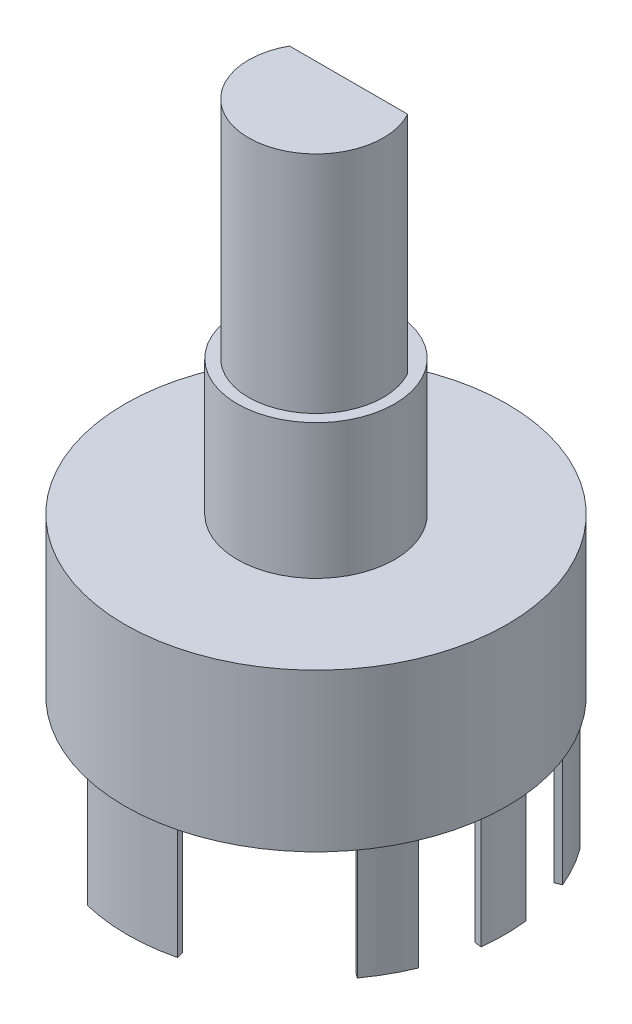
ISO-10303-21;
HEADER;
FILE_DESCRIPTION(('STEP AP214'),'2;1');
FILE_NAME('part.step','',(''),(''),'','','');
FILE_SCHEMA(('AUTOMOTIVE_DESIGN { 1 0 10303 214 1 1 1 1 }'));
ENDSEC;
DATA;
#1=APPLICATION_CONTEXT('core data for automotive mechanical design processes');
#2=APPLICATION_PROTOCOL_DEFINITION('international standard','automotive_design',2000,#1);
#3=PRODUCT_CONTEXT('',#1,'mechanical');
#4=PRODUCT('Part','Part','',(#3));
#5=PRODUCT_RELATED_PRODUCT_CATEGORY('part','',(#4));
#6=PRODUCT_DEFINITION_FORMATION('','',#4);
#7=PRODUCT_DEFINITION_CONTEXT('part definition',#1,'design');
#8=PRODUCT_DEFINITION('design','',#6,#7);
#9=PRODUCT_DEFINITION_SHAPE('','',#8);
#10=(LENGTH_UNIT() NAMED_UNIT(*) SI_UNIT(.MILLI.,.METRE.));
#11=(NAMED_UNIT(*) PLANE_ANGLE_UNIT() SI_UNIT($,.RADIAN.));
#12=(NAMED_UNIT(*) SI_UNIT($,.STERADIAN.) SOLID_ANGLE_UNIT());
#13=UNCERTAINTY_MEASURE_WITH_UNIT(LENGTH_MEASURE(1.E-05),#10,'distance_accuracy_value','');
#14=(GEOMETRIC_REPRESENTATION_CONTEXT(3) GLOBAL_UNCERTAINTY_ASSIGNED_CONTEXT((#13)) GLOBAL_UNIT_ASSIGNED_CONTEXT((#10,
#11,#12)) REPRESENTATION_CONTEXT('',''));
#15=CARTESIAN_POINT('',(0.,0.,0.));
#16=DIRECTION('',(0.,0.,1.));
#17=DIRECTION('',(1.,0.,0.));
#18=AXIS2_PLACEMENT_3D('',#15,#16,#17);
#19=CARTESIAN_POINT('',(0.,0.,0.));
#20=DIRECTION('',(0.,-1.,0.));
#21=DIRECTION('',(1.,0.,0.));
#22=AXIS2_PLACEMENT_3D('',#19,#20,#21);
#23=PLANE('',#22);
#24=CARTESIAN_POINT('',(0.,0.,0.));
#25=DIRECTION('',(0.,-1.,0.));
#26=DIRECTION('',(1.,0.,0.));
#27=AXIS2_PLACEMENT_3D('',#24,#25,#26);
#28=CIRCLE('',#27,8.5);
#29=CARTESIAN_POINT('',(8.5,0.,0.));
#30=VERTEX_POINT('',#29);
#31=EDGE_CURVE('E51',#30,#30,#28,.T.);
#32=ORIENTED_EDGE('',*,*,#31,.T.);
#33=EDGE_LOOP('',(#32));
#34=FACE_BOUND('',#33,.T.);
#35=DIRECTION('',(-0.992888545809193,0.,-0.119047619047618));
#36=VECTOR('',#35,1.);
#37=CARTESIAN_POINT('',(8.04239722105446,0.,0.964285714285714));
#38=LINE('',#37,#36);
#39=CARTESIAN_POINT('',(8.34026378479722,0.,1.));
#40=VERTEX_POINT('',#39);
#41=CARTESIAN_POINT('',(8.04239722105446,0.,0.964285714285714));
#42=VERTEX_POINT('',#41);
#43=EDGE_CURVE('E802',#40,#42,#38,.T.);
#44=ORIENTED_EDGE('',*,*,#43,.F.);
#45=CARTESIAN_POINT('',(0.,0.,0.));
#46=DIRECTION('',(0.,-1.,0.));
#47=DIRECTION('',(1.,0.,0.));
#48=AXIS2_PLACEMENT_3D('',#45,#46,#47);
#49=CIRCLE('',#48,8.4);
#50=CARTESIAN_POINT('',(8.34026378479722,0.,-1.));
#51=VERTEX_POINT('',#50);
#52=EDGE_CURVE('E772',#51,#40,#49,.T.);
#53=ORIENTED_EDGE('',*,*,#52,.F.);
#54=DIRECTION('',(0.992888545809193,0.,-0.119047619047618));
#55=VECTOR('',#54,1.);
#56=CARTESIAN_POINT('',(8.04239722105446,0.,-0.964285714285714));
#57=LINE('',#56,#55);
#58=CARTESIAN_POINT('',(8.04239722105446,0.,-0.964285714285714));
#59=VERTEX_POINT('',#58);
#60=EDGE_CURVE('E789',#59,#51,#57,.T.);
#61=ORIENTED_EDGE('',*,*,#60,.F.);
#62=CARTESIAN_POINT('',(0.,0.,0.));
#63=DIRECTION('',(0.,1.,0.));
#64=DIRECTION('',(1.,0.,0.));
#65=AXIS2_PLACEMENT_3D('',#62,#63,#64);
#66=CIRCLE('',#65,8.1);
#67=EDGE_CURVE('E805',#42,#59,#66,.T.);
#68=ORIENTED_EDGE('',*,*,#67,.F.);
#69=EDGE_LOOP('',(#44,#53,#61,#68));
#70=FACE_BOUND('',#69,.T.);
#71=DIRECTION('',(-0.807924716133116,0.,-0.589285714285713));
#72=VECTOR('',#71,1.);
#73=CARTESIAN_POINT('',(6.54419020067824,0.,4.77321428571429));
#74=LINE('',#73,#72);
#75=CARTESIAN_POINT('',(6.78656761551817,0.,4.95));
#76=VERTEX_POINT('',#75);
#77=CARTESIAN_POINT('',(6.54419020067824,0.,4.77321428571429));
#78=VERTEX_POINT('',#77);
#79=EDGE_CURVE('E765',#76,#78,#74,.T.);
#80=ORIENTED_EDGE('',*,*,#79,.F.);
#81=CARTESIAN_POINT('',(0.,0.,0.));
#82=DIRECTION('',(0.,-1.,0.));
#83=DIRECTION('',(1.,0.,0.));
#84=AXIS2_PLACEMENT_3D('',#81,#82,#83);
#85=CIRCLE('',#84,8.4);
#86=CARTESIAN_POINT('',(7.76439465971398,0.,3.20533548450159));
#87=VERTEX_POINT('',#86);
#88=EDGE_CURVE('E768',#87,#76,#85,.T.);
#89=ORIENTED_EDGE('',*,*,#88,.F.);
#90=DIRECTION('',(0.924332697584997,0.,0.381587557678762));
#91=VECTOR('',#90,1.);
#92=CARTESIAN_POINT('',(7.48709485043848,0.,3.09085921719796));
#93=LINE('',#92,#91);
#94=CARTESIAN_POINT('',(7.48709485043848,0.,3.09085921719796));
#95=VERTEX_POINT('',#94);
#96=EDGE_CURVE('E757',#95,#87,#93,.T.);
#97=ORIENTED_EDGE('',*,*,#96,.F.);
#98=CARTESIAN_POINT('',(0.,0.,0.));
#99=DIRECTION('',(0.,1.,0.));
#100=DIRECTION('',(1.,0.,0.));
#101=AXIS2_PLACEMENT_3D('',#98,#99,#100);
#102=CIRCLE('',#101,8.1);
#103=EDGE_CURVE('E760',#78,#95,#102,.T.);
#104=ORIENTED_EDGE('',*,*,#103,.F.);
#105=EDGE_LOOP('',(#80,#89,#97,#104));
#106=FACE_BOUND('',#105,.T.);
#107=DIRECTION('',(0.238095238095239,0.,0.971241812112911));
#108=VECTOR('',#107,1.);
#109=CARTESIAN_POINT('',(2.,0.,8.15843122174846));
#110=LINE('',#109,#108);
#111=CARTESIAN_POINT('',(1.92857142857143,0.,7.86705867811458));
#112=VERTEX_POINT('',#111);
#113=CARTESIAN_POINT('',(2.,0.,8.15843122174846));
#114=VERTEX_POINT('',#113);
#115=EDGE_CURVE('E724',#112,#114,#110,.T.);
#116=ORIENTED_EDGE('',*,*,#115,.F.);
#117=CARTESIAN_POINT('',(0.,0.,0.));
#118=DIRECTION('',(0.,1.,0.));
#119=DIRECTION('',(1.,0.,0.));
#120=AXIS2_PLACEMENT_3D('',#117,#118,#119);
#121=CIRCLE('',#120,8.1);
#122=CARTESIAN_POINT('',(-1.92857142857143,0.,7.86705867811458));
#123=VERTEX_POINT('',#122);
#124=EDGE_CURVE('E727',#123,#112,#121,.T.);
#125=ORIENTED_EDGE('',*,*,#124,.F.);
#126=DIRECTION('',(0.238095238095239,0.,-0.971241812112911));
#127=VECTOR('',#126,1.);
#128=CARTESIAN_POINT('',(-1.92857142857143,0.,7.86705867811458));
#129=LINE('',#128,#127);
#130=CARTESIAN_POINT('',(-2.,0.,8.15843122174846));
#131=VERTEX_POINT('',#130);
#132=EDGE_CURVE('E716',#131,#123,#129,.T.);
#133=ORIENTED_EDGE('',*,*,#132,.F.);
#134=CARTESIAN_POINT('',(0.,0.,0.));
#135=DIRECTION('',(0.,-1.,0.));
#136=DIRECTION('',(1.,0.,0.));
#137=AXIS2_PLACEMENT_3D('',#134,#135,#136);
#138=CIRCLE('',#137,8.4);
#139=EDGE_CURVE('E719',#114,#131,#138,.T.);
#140=ORIENTED_EDGE('',*,*,#139,.F.);
#141=EDGE_LOOP('',(#116,#125,#133,#140));
#142=FACE_BOUND('',#141,.T.);
#143=DIRECTION('',(-0.924332697584997,0.,0.381587557678762));
#144=VECTOR('',#143,1.);
#145=CARTESIAN_POINT('',(7.48709485043848,0.,-3.09085921719796));
#146=LINE('',#145,#144);
#147=CARTESIAN_POINT('',(7.76439465971398,0.,-3.20533548450159));
#148=VERTEX_POINT('',#147);
#149=CARTESIAN_POINT('',(7.48709485043848,0.,-3.09085921719796));
#150=VERTEX_POINT('',#149);
#151=EDGE_CURVE('E683',#148,#150,#146,.T.);
#152=ORIENTED_EDGE('',*,*,#151,.F.);
#153=CARTESIAN_POINT('',(0.,0.,0.));
#154=DIRECTION('',(0.,-1.,0.));
#155=DIRECTION('',(1.,0.,0.));
#156=AXIS2_PLACEMENT_3D('',#153,#154,#155);
#157=CIRCLE('',#156,8.4);
#158=CARTESIAN_POINT('',(6.78656761551817,0.,-4.95));
#159=VERTEX_POINT('',#158);
#160=EDGE_CURVE('E686',#159,#148,#157,.T.);
#161=ORIENTED_EDGE('',*,*,#160,.F.);
#162=DIRECTION('',(0.807924716133116,0.,-0.589285714285713));
#163=VECTOR('',#162,1.);
#164=CARTESIAN_POINT('',(6.54419020067824,0.,-4.77321428571429));
#165=LINE('',#164,#163);
#166=CARTESIAN_POINT('',(6.54419020067824,0.,-4.77321428571429));
#167=VERTEX_POINT('',#166);
#168=EDGE_CURVE('E675',#167,#159,#165,.T.);
#169=ORIENTED_EDGE('',*,*,#168,.F.);
#170=CARTESIAN_POINT('',(0.,0.,0.));
#171=DIRECTION('',(0.,1.,0.));
#172=DIRECTION('',(1.,0.,0.));
#173=AXIS2_PLACEMENT_3D('',#170,#171,#172);
#174=CIRCLE('',#173,8.1);
#175=EDGE_CURVE('E678',#150,#167,#174,.T.);
#176=ORIENTED_EDGE('',*,*,#175,.F.);
#177=EDGE_LOOP('',(#152,#161,#169,#176));
#178=FACE_BOUND('',#177,.T.);
#179=DIRECTION('',(-0.238095238095237,0.,0.971241812112912));
#180=VECTOR('',#179,1.);
#181=CARTESIAN_POINT('',(2.,0.,-8.15843122174846));
#182=LINE('',#181,#180);
#183=CARTESIAN_POINT('',(2.,0.,-8.15843122174846));
#184=VERTEX_POINT('',#183);
#185=CARTESIAN_POINT('',(1.92857142857143,0.,-7.86705867811459));
#186=VERTEX_POINT('',#185);
#187=EDGE_CURVE('E635',#184,#186,#182,.T.);
#188=ORIENTED_EDGE('',*,*,#187,.F.);
#189=CARTESIAN_POINT('',(0.,0.,0.));
#190=DIRECTION('',(0.,-1.,0.));
#191=DIRECTION('',(1.,0.,0.));
#192=AXIS2_PLACEMENT_3D('',#189,#190,#191);
#193=CIRCLE('',#192,8.4);
#194=CARTESIAN_POINT('',(-2.,0.,-8.15843122174846));
#195=VERTEX_POINT('',#194);
#196=EDGE_CURVE('E626',#195,#184,#193,.T.);
#197=ORIENTED_EDGE('',*,*,#196,.F.);
#198=DIRECTION('',(-0.238095238095237,0.,-0.971241812112912));
#199=VECTOR('',#198,1.);
#200=CARTESIAN_POINT('',(-1.92857142857143,0.,-7.86705867811458));
#201=LINE('',#200,#199);
#202=CARTESIAN_POINT('',(-1.92857142857143,0.,-7.86705867811458));
#203=VERTEX_POINT('',#202);
#204=EDGE_CURVE('E644',#203,#195,#201,.T.);
#205=ORIENTED_EDGE('',*,*,#204,.F.);
#206=CARTESIAN_POINT('',(0.,0.,0.));
#207=DIRECTION('',(0.,1.,0.));
#208=DIRECTION('',(1.,0.,0.));
#209=AXIS2_PLACEMENT_3D('',#206,#207,#208);
#210=CIRCLE('',#209,8.1);
#211=EDGE_CURVE('E638',#186,#203,#210,.T.);
#212=ORIENTED_EDGE('',*,*,#211,.F.);
#213=EDGE_LOOP('',(#188,#197,#205,#212));
#214=FACE_BOUND('',#213,.T.);
#215=ADVANCED_FACE('F43',(#34,#70,#106,#142,#178,#214),#23,.T.);
#216=CARTESIAN_POINT('',(3.43024899888577E-12,-1000.,0.));
#217=DIRECTION('',(0.,-1.,0.));
#218=DIRECTION('',(1.,0.,0.));
#219=AXIS2_PLACEMENT_3D('',#216,#217,#218);
#220=CYLINDRICAL_SURFACE('',#219,8.50000000000001);
#221=CARTESIAN_POINT('',(0.,6.9999999999999,0.));
#222=DIRECTION('',(0.,-1.,0.));
#223=DIRECTION('',(1.,0.,0.));
#224=AXIS2_PLACEMENT_3D('',#221,#222,#223);
#225=CIRCLE('',#224,8.50000000000002);
#226=CARTESIAN_POINT('',(8.5,6.99999999999992,0.));
#227=VERTEX_POINT('',#226);
#228=EDGE_CURVE('E225',#227,#227,#225,.T.);
#229=ORIENTED_EDGE('',*,*,#228,.T.);
#230=EDGE_LOOP('',(#229));
#231=FACE_BOUND('',#230,.T.);
#232=ORIENTED_EDGE('',*,*,#31,.F.);
#233=EDGE_LOOP('',(#232));
#234=FACE_BOUND('',#233,.T.);
#235=ADVANCED_FACE('F234',(#231,#234),#220,.T.);
#236=CARTESIAN_POINT('',(8.5,7.00000000000001,0.));
#237=DIRECTION('',(0.,1.,0.));
#238=DIRECTION('',(-1.,0.,0.));
#239=AXIS2_PLACEMENT_3D('',#236,#237,#238);
#240=PLANE('',#239);
#241=CARTESIAN_POINT('',(0.,6.9999999999999,0.));
#242=DIRECTION('',(0.,-1.,0.));
#243=DIRECTION('',(1.,0.,0.));
#244=AXIS2_PLACEMENT_3D('',#241,#242,#243);
#245=CIRCLE('',#244,3.50000000000002);
#246=CARTESIAN_POINT('',(3.5,6.99999999999991,0.));
#247=VERTEX_POINT('',#246);
#248=EDGE_CURVE('E216',#247,#247,#245,.T.);
#249=ORIENTED_EDGE('',*,*,#248,.T.);
#250=EDGE_LOOP('',(#249));
#251=FACE_BOUND('',#250,.T.);
#252=ORIENTED_EDGE('',*,*,#228,.F.);
#253=EDGE_LOOP('',(#252));
#254=FACE_BOUND('',#253,.T.);
#255=ADVANCED_FACE('F236',(#251,#254),#240,.T.);
#256=CARTESIAN_POINT('',(3.43024899888577E-12,-1000.,0.));
#257=DIRECTION('',(0.,-1.,0.));
#258=DIRECTION('',(1.,0.,0.));
#259=AXIS2_PLACEMENT_3D('',#256,#257,#258);
#260=CYLINDRICAL_SURFACE('',#259,3.50000000000003);
#261=CARTESIAN_POINT('',(0.,12.9999999999999,0.));
#262=DIRECTION('',(0.,-1.,0.));
#263=DIRECTION('',(1.,0.,0.));
#264=AXIS2_PLACEMENT_3D('',#261,#262,#263);
#265=CIRCLE('',#264,3.50000000000004);
#266=CARTESIAN_POINT('',(3.5,12.9999999999999,0.));
#267=VERTEX_POINT('',#266);
#268=EDGE_CURVE('E211',#267,#267,#265,.T.);
#269=ORIENTED_EDGE('',*,*,#268,.T.);
#270=EDGE_LOOP('',(#269));
#271=FACE_BOUND('',#270,.T.);
#272=ORIENTED_EDGE('',*,*,#248,.F.);
#273=EDGE_LOOP('',(#272));
#274=FACE_BOUND('',#273,.T.);
#275=ADVANCED_FACE('F242',(#271,#274),#260,.T.);
#276=CARTESIAN_POINT('',(3.5,13.,0.));
#277=DIRECTION('',(0.,1.,0.));
#278=DIRECTION('',(-1.,0.,0.));
#279=AXIS2_PLACEMENT_3D('',#276,#277,#278);
#280=PLANE('',#279);
#281=CARTESIAN_POINT('',(0.,12.9999999999999,0.));
#282=DIRECTION('',(0.,-1.,0.));
#283=DIRECTION('',(1.,0.,0.));
#284=AXIS2_PLACEMENT_3D('',#281,#282,#283);
#285=CIRCLE('',#284,3.00000000000004);
#286=CARTESIAN_POINT('',(2.62630919733384,12.9999999999999,-1.44999999999994));
#287=VERTEX_POINT('',#286);
#288=CARTESIAN_POINT('',(-2.62630919733393,12.9999999999999,-1.44999999999994));
#289=VERTEX_POINT('',#288);
#290=EDGE_CURVE('E202',#287,#289,#285,.T.);
#291=ORIENTED_EDGE('',*,*,#290,.T.);
#292=DIRECTION('',(1.,0.,0.));
#293=VECTOR('',#292,1.);
#294=CARTESIAN_POINT('',(-8.50000000000005,12.9999999999999,-1.44999999999994));
#295=LINE('',#294,#293);
#296=EDGE_CURVE('E190',#289,#287,#295,.T.);
#297=ORIENTED_EDGE('',*,*,#296,.T.);
#298=EDGE_LOOP('',(#291,#297));
#299=FACE_BOUND('',#298,.T.);
#300=ORIENTED_EDGE('',*,*,#268,.F.);
#301=EDGE_LOOP('',(#300));
#302=FACE_BOUND('',#301,.T.);
#303=ADVANCED_FACE('F208',(#299,#302),#280,.T.);
#304=CARTESIAN_POINT('',(3.43024899888577E-12,-1000.,0.));
#305=DIRECTION('',(0.,-1.,0.));
#306=DIRECTION('',(1.,0.,0.));
#307=AXIS2_PLACEMENT_3D('',#304,#305,#306);
#308=CYLINDRICAL_SURFACE('',#307,3.00000000000006);
#309=DIRECTION('',(0.,-1.,0.));
#310=VECTOR('',#309,1.);
#311=CARTESIAN_POINT('',(-2.62630919733038,-1000.,-1.45000000000007));
#312=LINE('',#311,#310);
#313=CARTESIAN_POINT('',(-2.62630919733398,22.9999999999999,-1.44999999999994));
#314=VERTEX_POINT('',#313);
#315=EDGE_CURVE('E57',#289,#314,#312,.F.);
#316=ORIENTED_EDGE('',*,*,#315,.F.);
#317=ORIENTED_EDGE('',*,*,#290,.F.);
#318=DIRECTION('',(0.,-1.,0.));
#319=VECTOR('',#318,1.);
#320=CARTESIAN_POINT('',(2.62630919733724,-1000.,-1.45000000000007));
#321=LINE('',#320,#319);
#322=CARTESIAN_POINT('',(2.62630919733382,22.9999999999999,-1.44999999999994));
#323=VERTEX_POINT('',#322);
#324=EDGE_CURVE('E193',#323,#287,#321,.T.);
#325=ORIENTED_EDGE('',*,*,#324,.F.);
#326=CARTESIAN_POINT('',(0.,22.9999999999999,0.));
#327=DIRECTION('',(0.,-1.,0.));
#328=DIRECTION('',(1.,0.,0.));
#329=AXIS2_PLACEMENT_3D('',#326,#327,#328);
#330=CIRCLE('',#329,3.00000000000008);
#331=EDGE_CURVE('E204',#323,#314,#330,.T.);
#332=ORIENTED_EDGE('',*,*,#331,.T.);
#333=EDGE_LOOP('',(#316,#317,#325,#332));
#334=FACE_BOUND('',#333,.T.);
#335=ADVANCED_FACE('F201',(#334),#308,.T.);
#336=CARTESIAN_POINT('',(3.,23.,0.));
#337=DIRECTION('',(0.,1.,0.));
#338=DIRECTION('',(-1.,0.,0.));
#339=AXIS2_PLACEMENT_3D('',#336,#337,#338);
#340=PLANE('',#339);
#341=DIRECTION('',(1.,0.,0.));
#342=VECTOR('',#341,1.);
#343=CARTESIAN_POINT('',(3.,23.,-1.44999999999994));
#344=LINE('',#343,#342);
#345=EDGE_CURVE('E11',#314,#323,#344,.T.);
#346=ORIENTED_EDGE('',*,*,#345,.F.);
#347=ORIENTED_EDGE('',*,*,#331,.F.);
#348=EDGE_LOOP('',(#346,#347));
#349=FACE_BOUND('',#348,.T.);
#350=ADVANCED_FACE('F253',(#349),#340,.T.);
#351=CARTESIAN_POINT('',(0.,-5.,0.));
#352=DIRECTION('',(0.,1.,0.));
#353=DIRECTION('',(-1.,0.,0.));
#354=AXIS2_PLACEMENT_3D('',#351,#352,#353);
#355=CYLINDRICAL_SURFACE('',#354,8.4);
#356=ORIENTED_EDGE('',*,*,#52,.T.);
#357=DIRECTION('',(0.,1.,0.));
#358=VECTOR('',#357,1.);
#359=CARTESIAN_POINT('',(8.34026378479724,-4.99999999999997,1.));
#360=LINE('',#359,#358);
#361=CARTESIAN_POINT('',(8.34026378479724,-4.99999999999997,1.));
#362=VERTEX_POINT('',#361);
#363=EDGE_CURVE('E218',#362,#40,#360,.T.);
#364=ORIENTED_EDGE('',*,*,#363,.F.);
#365=CARTESIAN_POINT('',(0.,-5.,0.));
#366=DIRECTION('',(0.,-1.,0.));
#367=DIRECTION('',(1.,0.,0.));
#368=AXIS2_PLACEMENT_3D('',#365,#366,#367);
#369=CIRCLE('',#368,8.4);
#370=CARTESIAN_POINT('',(8.34026378479724,-4.99999999999997,-1.));
#371=VERTEX_POINT('',#370);
#372=EDGE_CURVE('E784',#371,#362,#369,.T.);
#373=ORIENTED_EDGE('',*,*,#372,.F.);
#374=DIRECTION('',(0.,1.,0.));
#375=VECTOR('',#374,1.);
#376=CARTESIAN_POINT('',(8.34026378479724,-4.99999999999997,-1.));
#377=LINE('',#376,#375);
#378=EDGE_CURVE('E798',#371,#51,#377,.T.);
#379=ORIENTED_EDGE('',*,*,#378,.T.);
#380=EDGE_LOOP('',(#356,#364,#373,#379));
#381=FACE_BOUND('',#380,.T.);
#382=ADVANCED_FACE('F256',(#381),#355,.T.);
#383=CARTESIAN_POINT('',(8.04239722105448,-4.99999999999997,0.964285714285714));
#384=DIRECTION('',(0.119047619047618,0.,-0.992888545809193));
#385=DIRECTION('',(-0.992888545809193,0.,-0.119047619047618));
#386=AXIS2_PLACEMENT_3D('',#383,#384,#385);
#387=PLANE('',#386);
#388=ORIENTED_EDGE('',*,*,#43,.T.);
#389=DIRECTION('',(0.,1.,0.));
#390=VECTOR('',#389,1.);
#391=CARTESIAN_POINT('',(8.04239722105448,-4.99999999999997,0.964285714285714));
#392=LINE('',#391,#390);
#393=CARTESIAN_POINT('',(8.04239722105448,-4.99999999999997,0.964285714285714));
#394=VERTEX_POINT('',#393);
#395=EDGE_CURVE('E817',#394,#42,#392,.T.);
#396=ORIENTED_EDGE('',*,*,#395,.F.);
#397=DIRECTION('',(-0.992888545809193,0.,-0.119047619047618));
#398=VECTOR('',#397,1.);
#399=CARTESIAN_POINT('',(8.04239722105448,-4.99999999999997,0.964285714285714));
#400=LINE('',#399,#398);
#401=EDGE_CURVE('E788',#362,#394,#400,.T.);
#402=ORIENTED_EDGE('',*,*,#401,.F.);
#403=ORIENTED_EDGE('',*,*,#363,.T.);
#404=EDGE_LOOP('',(#388,#396,#402,#403));
#405=FACE_BOUND('',#404,.T.);
#406=ADVANCED_FACE('F260',(#405),#387,.F.);
#407=CARTESIAN_POINT('',(0.,-5.,0.));
#408=DIRECTION('',(0.,1.,0.));
#409=DIRECTION('',(-1.,0.,0.));
#410=AXIS2_PLACEMENT_3D('',#407,#408,#409);
#411=CYLINDRICAL_SURFACE('',#410,8.1);
#412=ORIENTED_EDGE('',*,*,#67,.T.);
#413=DIRECTION('',(0.,1.,0.));
#414=VECTOR('',#413,1.);
#415=CARTESIAN_POINT('',(8.04239722105448,-4.99999999999997,-0.964285714285717));
#416=LINE('',#415,#414);
#417=CARTESIAN_POINT('',(8.04239722105448,-4.99999999999997,-0.964285714285717));
#418=VERTEX_POINT('',#417);
#419=EDGE_CURVE('E814',#418,#59,#416,.T.);
#420=ORIENTED_EDGE('',*,*,#419,.F.);
#421=CARTESIAN_POINT('',(0.,-5.,0.));
#422=DIRECTION('',(0.,1.,0.));
#423=DIRECTION('',(1.,0.,0.));
#424=AXIS2_PLACEMENT_3D('',#421,#422,#423);
#425=CIRCLE('',#424,8.1);
#426=EDGE_CURVE('E792',#394,#418,#425,.T.);
#427=ORIENTED_EDGE('',*,*,#426,.F.);
#428=ORIENTED_EDGE('',*,*,#395,.T.);
#429=EDGE_LOOP('',(#412,#420,#427,#428));
#430=FACE_BOUND('',#429,.T.);
#431=ADVANCED_FACE('F264',(#430),#411,.F.);
#432=CARTESIAN_POINT('',(8.04239722105448,-4.99999999999997,-0.964285714285714));
#433=DIRECTION('',(0.119047619047618,0.,0.992888545809193));
#434=DIRECTION('',(0.992888545809193,0.,-0.119047619047618));
#435=AXIS2_PLACEMENT_3D('',#432,#433,#434);
#436=PLANE('',#435);
#437=ORIENTED_EDGE('',*,*,#60,.T.);
#438=ORIENTED_EDGE('',*,*,#378,.F.);
#439=DIRECTION('',(0.992888545809193,0.,-0.119047619047618));
#440=VECTOR('',#439,1.);
#441=CARTESIAN_POINT('',(8.04239722105448,-4.99999999999997,-0.964285714285714));
#442=LINE('',#441,#440);
#443=EDGE_CURVE('E795',#418,#371,#442,.T.);
#444=ORIENTED_EDGE('',*,*,#443,.F.);
#445=ORIENTED_EDGE('',*,*,#419,.T.);
#446=EDGE_LOOP('',(#437,#438,#444,#445));
#447=FACE_BOUND('',#446,.T.);
#448=ADVANCED_FACE('F268',(#447),#436,.F.);
#449=CARTESIAN_POINT('',(0.,-5.,0.));
#450=DIRECTION('',(0.,-1.,0.));
#451=DIRECTION('',(1.,0.,0.));
#452=AXIS2_PLACEMENT_3D('',#449,#450,#451);
#453=PLANE('',#452);
#454=ORIENTED_EDGE('',*,*,#372,.T.);
#455=ORIENTED_EDGE('',*,*,#401,.T.);
#456=ORIENTED_EDGE('',*,*,#426,.T.);
#457=ORIENTED_EDGE('',*,*,#443,.T.);
#458=EDGE_LOOP('',(#454,#455,#456,#457));
#459=FACE_BOUND('',#458,.T.);
#460=ADVANCED_FACE('F272',(#459),#453,.T.);
#461=CARTESIAN_POINT('',(0.,-5.,0.));
#462=DIRECTION('',(0.,1.,0.));
#463=DIRECTION('',(-1.,0.,0.));
#464=AXIS2_PLACEMENT_3D('',#461,#462,#463);
#465=CYLINDRICAL_SURFACE('',#464,8.4);
#466=ORIENTED_EDGE('',*,*,#88,.T.);
#467=DIRECTION('',(0.,1.,0.));
#468=VECTOR('',#467,1.);
#469=CARTESIAN_POINT('',(6.78656761551819,-4.99999999999998,4.95));
#470=LINE('',#469,#468);
#471=CARTESIAN_POINT('',(6.78656761551819,-4.99999999999998,4.95));
#472=VERTEX_POINT('',#471);
#473=EDGE_CURVE('E731',#472,#76,#470,.T.);
#474=ORIENTED_EDGE('',*,*,#473,.F.);
#475=CARTESIAN_POINT('',(0.,-5.,0.));
#476=DIRECTION('',(0.,-1.,0.));
#477=DIRECTION('',(1.,0.,0.));
#478=AXIS2_PLACEMENT_3D('',#475,#476,#477);
#479=CIRCLE('',#478,8.4);
#480=CARTESIAN_POINT('',(7.764394659714,-4.99999999999997,3.20533548450159));
#481=VERTEX_POINT('',#480);
#482=EDGE_CURVE('E761',#481,#472,#479,.T.);
#483=ORIENTED_EDGE('',*,*,#482,.F.);
#484=DIRECTION('',(0.,1.,0.));
#485=VECTOR('',#484,1.);
#486=CARTESIAN_POINT('',(7.764394659714,-4.99999999999997,3.20533548450159));
#487=LINE('',#486,#485);
#488=EDGE_CURVE('E752',#481,#87,#487,.T.);
#489=ORIENTED_EDGE('',*,*,#488,.T.);
#490=EDGE_LOOP('',(#466,#474,#483,#489));
#491=FACE_BOUND('',#490,.T.);
#492=ADVANCED_FACE('F276',(#491),#465,.T.);
#493=CARTESIAN_POINT('',(6.54419020067826,-4.99999999999998,4.77321428571429));
#494=DIRECTION('',(0.589285714285713,0.,-0.807924716133116));
#495=DIRECTION('',(-0.807924716133116,0.,-0.589285714285713));
#496=AXIS2_PLACEMENT_3D('',#493,#494,#495);
#497=PLANE('',#496);
#498=ORIENTED_EDGE('',*,*,#79,.T.);
#499=DIRECTION('',(0.,1.,0.));
#500=VECTOR('',#499,1.);
#501=CARTESIAN_POINT('',(6.54419020067826,-4.99999999999998,4.77321428571429));
#502=LINE('',#501,#500);
#503=CARTESIAN_POINT('',(6.54419020067826,-4.99999999999998,4.77321428571429));
#504=VERTEX_POINT('',#503);
#505=EDGE_CURVE('E745',#504,#78,#502,.T.);
#506=ORIENTED_EDGE('',*,*,#505,.F.);
#507=DIRECTION('',(-0.807924716133116,0.,-0.589285714285713));
#508=VECTOR('',#507,1.);
#509=CARTESIAN_POINT('',(6.54419020067826,-4.99999999999998,4.77321428571429));
#510=LINE('',#509,#508);
#511=EDGE_CURVE('E778',#472,#504,#510,.T.);
#512=ORIENTED_EDGE('',*,*,#511,.F.);
#513=ORIENTED_EDGE('',*,*,#473,.T.);
#514=EDGE_LOOP('',(#498,#506,#512,#513));
#515=FACE_BOUND('',#514,.T.);
#516=ADVANCED_FACE('F290',(#515),#497,.F.);
#517=CARTESIAN_POINT('',(0.,-5.,0.));
#518=DIRECTION('',(0.,1.,0.));
#519=DIRECTION('',(-1.,0.,0.));
#520=AXIS2_PLACEMENT_3D('',#517,#518,#519);
#521=CYLINDRICAL_SURFACE('',#520,8.1);
#522=ORIENTED_EDGE('',*,*,#103,.T.);
#523=DIRECTION('',(0.,1.,0.));
#524=VECTOR('',#523,1.);
#525=CARTESIAN_POINT('',(7.4870948504385,-4.99999999999997,3.09085921719796));
#526=LINE('',#525,#524);
#527=CARTESIAN_POINT('',(7.4870948504385,-4.99999999999997,3.09085921719796));
#528=VERTEX_POINT('',#527);
#529=EDGE_CURVE('E749',#528,#95,#526,.T.);
#530=ORIENTED_EDGE('',*,*,#529,.F.);
#531=CARTESIAN_POINT('',(0.,-5.,0.));
#532=DIRECTION('',(0.,1.,0.));
#533=DIRECTION('',(1.,0.,0.));
#534=AXIS2_PLACEMENT_3D('',#531,#532,#533);
#535=CIRCLE('',#534,8.1);
#536=EDGE_CURVE('E775',#504,#528,#535,.T.);
#537=ORIENTED_EDGE('',*,*,#536,.F.);
#538=ORIENTED_EDGE('',*,*,#505,.T.);
#539=EDGE_LOOP('',(#522,#530,#537,#538));
#540=FACE_BOUND('',#539,.T.);
#541=ADVANCED_FACE('F286',(#540),#521,.F.);
#542=CARTESIAN_POINT('',(7.4870948504385,-4.99999999999997,3.09085921719796));
#543=DIRECTION('',(-0.381587557678762,0.,0.924332697584997));
#544=DIRECTION('',(0.924332697584997,0.,0.381587557678762));
#545=AXIS2_PLACEMENT_3D('',#542,#543,#544);
#546=PLANE('',#545);
#547=ORIENTED_EDGE('',*,*,#96,.T.);
#548=ORIENTED_EDGE('',*,*,#488,.F.);
#549=DIRECTION('',(0.924332697584997,0.,0.381587557678762));
#550=VECTOR('',#549,1.);
#551=CARTESIAN_POINT('',(7.4870948504385,-4.99999999999997,3.09085921719796));
#552=LINE('',#551,#550);
#553=EDGE_CURVE('E756',#528,#481,#552,.T.);
#554=ORIENTED_EDGE('',*,*,#553,.F.);
#555=ORIENTED_EDGE('',*,*,#529,.T.);
#556=EDGE_LOOP('',(#547,#548,#554,#555));
#557=FACE_BOUND('',#556,.T.);
#558=ADVANCED_FACE('F282',(#557),#546,.F.);
#559=CARTESIAN_POINT('',(0.,-5.,0.));
#560=DIRECTION('',(0.,-1.,0.));
#561=DIRECTION('',(1.,0.,0.));
#562=AXIS2_PLACEMENT_3D('',#559,#560,#561);
#563=PLANE('',#562);
#564=ORIENTED_EDGE('',*,*,#482,.T.);
#565=ORIENTED_EDGE('',*,*,#511,.T.);
#566=ORIENTED_EDGE('',*,*,#536,.T.);
#567=ORIENTED_EDGE('',*,*,#553,.T.);
#568=EDGE_LOOP('',(#564,#565,#566,#567));
#569=FACE_BOUND('',#568,.T.);
#570=ADVANCED_FACE('F278',(#569),#563,.T.);
#571=CARTESIAN_POINT('',(0.,-5.,0.));
#572=DIRECTION('',(0.,1.,0.));
#573=DIRECTION('',(-1.,0.,0.));
#574=AXIS2_PLACEMENT_3D('',#571,#572,#573);
#575=CYLINDRICAL_SURFACE('',#574,8.1);
#576=ORIENTED_EDGE('',*,*,#124,.T.);
#577=DIRECTION('',(0.,1.,0.));
#578=VECTOR('',#577,1.);
#579=CARTESIAN_POINT('',(1.92857142857145,-4.99999999999999,7.86705867811458));
#580=LINE('',#579,#578);
#581=CARTESIAN_POINT('',(1.92857142857145,-4.99999999999999,7.86705867811458));
#582=VERTEX_POINT('',#581);
#583=EDGE_CURVE('E690',#582,#112,#580,.T.);
#584=ORIENTED_EDGE('',*,*,#583,.F.);
#585=CARTESIAN_POINT('',(0.,-5.,0.));
#586=DIRECTION('',(0.,1.,0.));
#587=DIRECTION('',(1.,0.,0.));
#588=AXIS2_PLACEMENT_3D('',#585,#586,#587);
#589=CIRCLE('',#588,8.1);
#590=CARTESIAN_POINT('',(-1.92857142857141,-5.00000000000001,7.86705867811458));
#591=VERTEX_POINT('',#590);
#592=EDGE_CURVE('E720',#591,#582,#589,.T.);
#593=ORIENTED_EDGE('',*,*,#592,.F.);
#594=DIRECTION('',(0.,1.,0.));
#595=VECTOR('',#594,1.);
#596=CARTESIAN_POINT('',(-1.92857142857141,-5.00000000000001,7.86705867811458));
#597=LINE('',#596,#595);
#598=EDGE_CURVE('E711',#591,#123,#597,.T.);
#599=ORIENTED_EDGE('',*,*,#598,.T.);
#600=EDGE_LOOP('',(#576,#584,#593,#599));
#601=FACE_BOUND('',#600,.T.);
#602=ADVANCED_FACE('F281',(#601),#575,.F.);
#603=CARTESIAN_POINT('',(2.00000000000002,-4.99999999999999,8.15843122174846));
#604=DIRECTION('',(-0.971241812112911,0.,0.238095238095239));
#605=DIRECTION('',(0.238095238095239,0.,0.971241812112911));
#606=AXIS2_PLACEMENT_3D('',#603,#604,#605);
#607=PLANE('',#606);
#608=ORIENTED_EDGE('',*,*,#115,.T.);
#609=DIRECTION('',(0.,1.,0.));
#610=VECTOR('',#609,1.);
#611=CARTESIAN_POINT('',(2.00000000000002,-4.99999999999999,8.15843122174846));
#612=LINE('',#611,#610);
#613=CARTESIAN_POINT('',(2.00000000000002,-4.99999999999999,8.15843122174846));
#614=VERTEX_POINT('',#613);
#615=EDGE_CURVE('E704',#614,#114,#612,.T.);
#616=ORIENTED_EDGE('',*,*,#615,.F.);
#617=DIRECTION('',(0.238095238095239,0.,0.971241812112911));
#618=VECTOR('',#617,1.);
#619=CARTESIAN_POINT('',(2.00000000000002,-4.99999999999999,8.15843122174846));
#620=LINE('',#619,#618);
#621=EDGE_CURVE('E737',#582,#614,#620,.T.);
#622=ORIENTED_EDGE('',*,*,#621,.F.);
#623=ORIENTED_EDGE('',*,*,#583,.T.);
#624=EDGE_LOOP('',(#608,#616,#622,#623));
#625=FACE_BOUND('',#624,.T.);
#626=ADVANCED_FACE('F310',(#625),#607,.F.);
#627=CARTESIAN_POINT('',(0.,-5.,0.));
#628=DIRECTION('',(0.,1.,0.));
#629=DIRECTION('',(-1.,0.,0.));
#630=AXIS2_PLACEMENT_3D('',#627,#628,#629);
#631=CYLINDRICAL_SURFACE('',#630,8.4);
#632=ORIENTED_EDGE('',*,*,#139,.T.);
#633=DIRECTION('',(0.,1.,0.));
#634=VECTOR('',#633,1.);
#635=CARTESIAN_POINT('',(-1.99999999999998,-5.00000000000001,8.15843122174846));
#636=LINE('',#635,#634);
#637=CARTESIAN_POINT('',(-1.99999999999998,-5.00000000000001,8.15843122174846));
#638=VERTEX_POINT('',#637);
#639=EDGE_CURVE('E708',#638,#131,#636,.T.);
#640=ORIENTED_EDGE('',*,*,#639,.F.);
#641=CARTESIAN_POINT('',(0.,-5.,0.));
#642=DIRECTION('',(0.,-1.,0.));
#643=DIRECTION('',(1.,0.,0.));
#644=AXIS2_PLACEMENT_3D('',#641,#642,#643);
#645=CIRCLE('',#644,8.4);
#646=EDGE_CURVE('E734',#614,#638,#645,.T.);
#647=ORIENTED_EDGE('',*,*,#646,.F.);
#648=ORIENTED_EDGE('',*,*,#615,.T.);
#649=EDGE_LOOP('',(#632,#640,#647,#648));
#650=FACE_BOUND('',#649,.T.);
#651=ADVANCED_FACE('F306',(#650),#631,.T.);
#652=CARTESIAN_POINT('',(-1.92857142857141,-5.00000000000001,7.86705867811458));
#653=DIRECTION('',(0.971241812112911,0.,0.238095238095239));
#654=DIRECTION('',(0.238095238095239,0.,-0.971241812112911));
#655=AXIS2_PLACEMENT_3D('',#652,#653,#654);
#656=PLANE('',#655);
#657=ORIENTED_EDGE('',*,*,#132,.T.);
#658=ORIENTED_EDGE('',*,*,#598,.F.);
#659=DIRECTION('',(0.238095238095239,0.,-0.971241812112911));
#660=VECTOR('',#659,1.);
#661=CARTESIAN_POINT('',(-1.92857142857141,-5.00000000000001,7.86705867811458));
#662=LINE('',#661,#660);
#663=EDGE_CURVE('E715',#638,#591,#662,.T.);
#664=ORIENTED_EDGE('',*,*,#663,.F.);
#665=ORIENTED_EDGE('',*,*,#639,.T.);
#666=EDGE_LOOP('',(#657,#658,#664,#665));
#667=FACE_BOUND('',#666,.T.);
#668=ADVANCED_FACE('F302',(#667),#656,.F.);
#669=CARTESIAN_POINT('',(0.,-5.,0.));
#670=DIRECTION('',(0.,-1.,0.));
#671=DIRECTION('',(1.,0.,0.));
#672=AXIS2_PLACEMENT_3D('',#669,#670,#671);
#673=PLANE('',#672);
#674=ORIENTED_EDGE('',*,*,#592,.T.);
#675=ORIENTED_EDGE('',*,*,#621,.T.);
#676=ORIENTED_EDGE('',*,*,#646,.T.);
#677=ORIENTED_EDGE('',*,*,#663,.T.);
#678=EDGE_LOOP('',(#674,#675,#676,#677));
#679=FACE_BOUND('',#678,.T.);
#680=ADVANCED_FACE('F298',(#679),#673,.T.);
#681=CARTESIAN_POINT('',(0.,-5.,0.));
#682=DIRECTION('',(0.,1.,0.));
#683=DIRECTION('',(-1.,0.,0.));
#684=AXIS2_PLACEMENT_3D('',#681,#682,#683);
#685=CYLINDRICAL_SURFACE('',#684,8.4);
#686=ORIENTED_EDGE('',*,*,#160,.T.);
#687=DIRECTION('',(0.,1.,0.));
#688=VECTOR('',#687,1.);
#689=CARTESIAN_POINT('',(7.764394659714,-4.99999999999997,-3.20533548450159));
#690=LINE('',#689,#688);
#691=CARTESIAN_POINT('',(7.764394659714,-4.99999999999997,-3.20533548450159));
#692=VERTEX_POINT('',#691);
#693=EDGE_CURVE('E634',#692,#148,#690,.T.);
#694=ORIENTED_EDGE('',*,*,#693,.F.);
#695=CARTESIAN_POINT('',(0.,-5.,0.));
#696=DIRECTION('',(0.,-1.,0.));
#697=DIRECTION('',(1.,0.,0.));
#698=AXIS2_PLACEMENT_3D('',#695,#696,#697);
#699=CIRCLE('',#698,8.4);
#700=CARTESIAN_POINT('',(6.78656761551819,-4.99999999999998,-4.95));
#701=VERTEX_POINT('',#700);
#702=EDGE_CURVE('E679',#701,#692,#699,.T.);
#703=ORIENTED_EDGE('',*,*,#702,.F.);
#704=DIRECTION('',(0.,1.,0.));
#705=VECTOR('',#704,1.);
#706=CARTESIAN_POINT('',(6.78656761551819,-4.99999999999998,-4.95));
#707=LINE('',#706,#705);
#708=EDGE_CURVE('E670',#701,#159,#707,.T.);
#709=ORIENTED_EDGE('',*,*,#708,.T.);
#710=EDGE_LOOP('',(#686,#694,#703,#709));
#711=FACE_BOUND('',#710,.T.);
#712=ADVANCED_FACE('F301',(#711),#685,.T.);
#713=CARTESIAN_POINT('',(7.4870948504385,-4.99999999999997,-3.09085921719796));
#714=DIRECTION('',(-0.381587557678762,0.,-0.924332697584997));
#715=DIRECTION('',(-0.924332697584997,0.,0.381587557678762));
#716=AXIS2_PLACEMENT_3D('',#713,#714,#715);
#717=PLANE('',#716);
#718=ORIENTED_EDGE('',*,*,#151,.T.);
#719=DIRECTION('',(0.,1.,0.));
#720=VECTOR('',#719,1.);
#721=CARTESIAN_POINT('',(7.4870948504385,-4.99999999999997,-3.09085921719796));
#722=LINE('',#721,#720);
#723=CARTESIAN_POINT('',(7.4870948504385,-4.99999999999997,-3.09085921719796));
#724=VERTEX_POINT('',#723);
#725=EDGE_CURVE('E663',#724,#150,#722,.T.);
#726=ORIENTED_EDGE('',*,*,#725,.F.);
#727=DIRECTION('',(-0.924332697584997,0.,0.381587557678762));
#728=VECTOR('',#727,1.);
#729=CARTESIAN_POINT('',(7.4870948504385,-4.99999999999997,-3.09085921719796));
#730=LINE('',#729,#728);
#731=EDGE_CURVE('E696',#692,#724,#730,.T.);
#732=ORIENTED_EDGE('',*,*,#731,.F.);
#733=ORIENTED_EDGE('',*,*,#693,.T.);
#734=EDGE_LOOP('',(#718,#726,#732,#733));
#735=FACE_BOUND('',#734,.T.);
#736=ADVANCED_FACE('F330',(#735),#717,.F.);
#737=CARTESIAN_POINT('',(0.,-5.,0.));
#738=DIRECTION('',(0.,1.,0.));
#739=DIRECTION('',(-1.,0.,0.));
#740=AXIS2_PLACEMENT_3D('',#737,#738,#739);
#741=CYLINDRICAL_SURFACE('',#740,8.1);
#742=ORIENTED_EDGE('',*,*,#175,.T.);
#743=DIRECTION('',(0.,1.,0.));
#744=VECTOR('',#743,1.);
#745=CARTESIAN_POINT('',(6.54419020067825,-4.99999999999998,-4.77321428571429));
#746=LINE('',#745,#744);
#747=CARTESIAN_POINT('',(6.54419020067825,-4.99999999999998,-4.77321428571429));
#748=VERTEX_POINT('',#747);
#749=EDGE_CURVE('E667',#748,#167,#746,.T.);
#750=ORIENTED_EDGE('',*,*,#749,.F.);
#751=CARTESIAN_POINT('',(0.,-5.,0.));
#752=DIRECTION('',(0.,1.,0.));
#753=DIRECTION('',(1.,0.,0.));
#754=AXIS2_PLACEMENT_3D('',#751,#752,#753);
#755=CIRCLE('',#754,8.1);
#756=EDGE_CURVE('E693',#724,#748,#755,.T.);
#757=ORIENTED_EDGE('',*,*,#756,.F.);
#758=ORIENTED_EDGE('',*,*,#725,.T.);
#759=EDGE_LOOP('',(#742,#750,#757,#758));
#760=FACE_BOUND('',#759,.T.);
#761=ADVANCED_FACE('F326',(#760),#741,.F.);
#762=CARTESIAN_POINT('',(6.54419020067826,-4.99999999999998,-4.77321428571429));
#763=DIRECTION('',(0.589285714285713,0.,0.807924716133116));
#764=DIRECTION('',(0.807924716133116,0.,-0.589285714285713));
#765=AXIS2_PLACEMENT_3D('',#762,#763,#764);
#766=PLANE('',#765);
#767=ORIENTED_EDGE('',*,*,#168,.T.);
#768=ORIENTED_EDGE('',*,*,#708,.F.);
#769=DIRECTION('',(0.807924716133116,0.,-0.589285714285713));
#770=VECTOR('',#769,1.);
#771=CARTESIAN_POINT('',(6.54419020067826,-4.99999999999998,-4.77321428571429));
#772=LINE('',#771,#770);
#773=EDGE_CURVE('E674',#748,#701,#772,.T.);
#774=ORIENTED_EDGE('',*,*,#773,.F.);
#775=ORIENTED_EDGE('',*,*,#749,.T.);
#776=EDGE_LOOP('',(#767,#768,#774,#775));
#777=FACE_BOUND('',#776,.T.);
#778=ADVANCED_FACE('F322',(#777),#766,.F.);
#779=CARTESIAN_POINT('',(0.,-5.,0.));
#780=DIRECTION('',(0.,-1.,0.));
#781=DIRECTION('',(1.,0.,0.));
#782=AXIS2_PLACEMENT_3D('',#779,#780,#781);
#783=PLANE('',#782);
#784=ORIENTED_EDGE('',*,*,#702,.T.);
#785=ORIENTED_EDGE('',*,*,#731,.T.);
#786=ORIENTED_EDGE('',*,*,#756,.T.);
#787=ORIENTED_EDGE('',*,*,#773,.T.);
#788=EDGE_LOOP('',(#784,#785,#786,#787));
#789=FACE_BOUND('',#788,.T.);
#790=ADVANCED_FACE('F318',(#789),#783,.T.);
#791=CARTESIAN_POINT('',(0.,-5.,0.));
#792=DIRECTION('',(0.,1.,0.));
#793=DIRECTION('',(-1.,0.,0.));
#794=AXIS2_PLACEMENT_3D('',#791,#792,#793);
#795=CYLINDRICAL_SURFACE('',#794,8.4);
#796=ORIENTED_EDGE('',*,*,#196,.T.);
#797=DIRECTION('',(0.,1.,0.));
#798=VECTOR('',#797,1.);
#799=CARTESIAN_POINT('',(2.00000000000002,-4.99999999999999,-8.15843122174846));
#800=LINE('',#799,#798);
#801=CARTESIAN_POINT('',(2.00000000000002,-4.99999999999999,-8.15843122174846));
#802=VERTEX_POINT('',#801);
#803=EDGE_CURVE('E206',#802,#184,#800,.T.);
#804=ORIENTED_EDGE('',*,*,#803,.F.);
#805=CARTESIAN_POINT('',(0.,-5.,0.));
#806=DIRECTION('',(0.,-1.,0.));
#807=DIRECTION('',(1.,0.,0.));
#808=AXIS2_PLACEMENT_3D('',#805,#806,#807);
#809=CIRCLE('',#808,8.4);
#810=CARTESIAN_POINT('',(-1.99999999999998,-5.00000000000001,-8.15843122174846));
#811=VERTEX_POINT('',#810);
#812=EDGE_CURVE('E657',#811,#802,#809,.T.);
#813=ORIENTED_EDGE('',*,*,#812,.F.);
#814=DIRECTION('',(0.,1.,0.));
#815=VECTOR('',#814,1.);
#816=CARTESIAN_POINT('',(-1.99999999999998,-5.00000000000001,-8.15843122174846));
#817=LINE('',#816,#815);
#818=EDGE_CURVE('E630',#811,#195,#817,.T.);
#819=ORIENTED_EDGE('',*,*,#818,.T.);
#820=EDGE_LOOP('',(#796,#804,#813,#819));
#821=FACE_BOUND('',#820,.T.);
#822=ADVANCED_FACE('F321',(#821),#795,.T.);
#823=CARTESIAN_POINT('',(2.00000000000002,-4.99999999999999,-8.15843122174846));
#824=DIRECTION('',(-0.971241812112912,0.,-0.238095238095237));
#825=DIRECTION('',(-0.238095238095237,0.,0.971241812112912));
#826=AXIS2_PLACEMENT_3D('',#823,#824,#825);
#827=PLANE('',#826);
#828=ORIENTED_EDGE('',*,*,#187,.T.);
#829=DIRECTION('',(0.,1.,0.));
#830=VECTOR('',#829,1.);
#831=CARTESIAN_POINT('',(1.92857142857144,-4.99999999999999,-7.86705867811459));
#832=LINE('',#831,#830);
#833=CARTESIAN_POINT('',(1.92857142857144,-4.99999999999999,-7.86705867811459));
#834=VERTEX_POINT('',#833);
#835=EDGE_CURVE('E874',#834,#186,#832,.T.);
#836=ORIENTED_EDGE('',*,*,#835,.F.);
#837=DIRECTION('',(-0.238095238095237,0.,0.971241812112912));
#838=VECTOR('',#837,1.);
#839=CARTESIAN_POINT('',(2.00000000000002,-4.99999999999999,-8.15843122174846));
#840=LINE('',#839,#838);
#841=EDGE_CURVE('E654',#802,#834,#840,.T.);
#842=ORIENTED_EDGE('',*,*,#841,.F.);
#843=ORIENTED_EDGE('',*,*,#803,.T.);
#844=EDGE_LOOP('',(#828,#836,#842,#843));
#845=FACE_BOUND('',#844,.T.);
#846=ADVANCED_FACE('F348',(#845),#827,.F.);
#847=CARTESIAN_POINT('',(0.,-5.,0.));
#848=DIRECTION('',(0.,1.,0.));
#849=DIRECTION('',(-1.,0.,0.));
#850=AXIS2_PLACEMENT_3D('',#847,#848,#849);
#851=CYLINDRICAL_SURFACE('',#850,8.1);
#852=ORIENTED_EDGE('',*,*,#211,.T.);
#853=DIRECTION('',(0.,1.,0.));
#854=VECTOR('',#853,1.);
#855=CARTESIAN_POINT('',(-1.92857142857141,-5.00000000000001,-7.86705867811458));
#856=LINE('',#855,#854);
#857=CARTESIAN_POINT('',(-1.92857142857141,-5.00000000000001,-7.86705867811458));
#858=VERTEX_POINT('',#857);
#859=EDGE_CURVE('E65',#858,#203,#856,.T.);
#860=ORIENTED_EDGE('',*,*,#859,.F.);
#861=CARTESIAN_POINT('',(0.,-5.,0.));
#862=DIRECTION('',(0.,1.,0.));
#863=DIRECTION('',(1.,0.,0.));
#864=AXIS2_PLACEMENT_3D('',#861,#862,#863);
#865=CIRCLE('',#864,8.1);
#866=EDGE_CURVE('E651',#834,#858,#865,.T.);
#867=ORIENTED_EDGE('',*,*,#866,.F.);
#868=ORIENTED_EDGE('',*,*,#835,.T.);
#869=EDGE_LOOP('',(#852,#860,#867,#868));
#870=FACE_BOUND('',#869,.T.);
#871=ADVANCED_FACE('F345',(#870),#851,.F.);
#872=CARTESIAN_POINT('',(-1.92857142857141,-5.00000000000001,-7.86705867811458));
#873=DIRECTION('',(0.971241812112912,0.,-0.238095238095237));
#874=DIRECTION('',(-0.238095238095237,0.,-0.971241812112912));
#875=AXIS2_PLACEMENT_3D('',#872,#873,#874);
#876=PLANE('',#875);
#877=ORIENTED_EDGE('',*,*,#204,.T.);
#878=ORIENTED_EDGE('',*,*,#818,.F.);
#879=DIRECTION('',(-0.238095238095237,0.,-0.971241812112912));
#880=VECTOR('',#879,1.);
#881=CARTESIAN_POINT('',(-1.92857142857141,-5.00000000000001,-7.86705867811458));
#882=LINE('',#881,#880);
#883=EDGE_CURVE('E648',#858,#811,#882,.T.);
#884=ORIENTED_EDGE('',*,*,#883,.F.);
#885=ORIENTED_EDGE('',*,*,#859,.T.);
#886=EDGE_LOOP('',(#877,#878,#884,#885));
#887=FACE_BOUND('',#886,.T.);
#888=ADVANCED_FACE('F341',(#887),#876,.F.);
#889=CARTESIAN_POINT('',(0.,-5.,0.));
#890=DIRECTION('',(0.,-1.,0.));
#891=DIRECTION('',(1.,0.,0.));
#892=AXIS2_PLACEMENT_3D('',#889,#890,#891);
#893=PLANE('',#892);
#894=ORIENTED_EDGE('',*,*,#812,.T.);
#895=ORIENTED_EDGE('',*,*,#841,.T.);
#896=ORIENTED_EDGE('',*,*,#866,.T.);
#897=ORIENTED_EDGE('',*,*,#883,.T.);
#898=EDGE_LOOP('',(#894,#895,#896,#897));
#899=FACE_BOUND('',#898,.T.);
#900=ADVANCED_FACE('F338',(#899),#893,.T.);
#901=CARTESIAN_POINT('',(-8.50000000000005,22.9999999999999,-1.44999999999994));
#902=DIRECTION('',(0.,0.,1.));
#903=DIRECTION('',(0.,-1.,0.));
#904=AXIS2_PLACEMENT_3D('',#901,#902,#903);
#905=PLANE('',#904);
#906=ORIENTED_EDGE('',*,*,#315,.T.);
#907=ORIENTED_EDGE('',*,*,#345,.T.);
#908=ORIENTED_EDGE('',*,*,#324,.T.);
#909=ORIENTED_EDGE('',*,*,#296,.F.);
#910=EDGE_LOOP('',(#906,#907,#908,#909));
#911=FACE_BOUND('',#910,.T.);
#912=ADVANCED_FACE('F191',(#911),#905,.F.);
#913=CLOSED_SHELL('',(#215,#235,#255,#275,#303,#335,#350,#382,#406,#431,#448,#460,#492,#516,
#541,#558,#570,#602,#626,#651,#668,#680,#712,#736,#761,#778,#790,#822,#846,#871,#888,#900,#912));
#914=MANIFOLD_SOLID_BREP('B2',#913);
#915=ADVANCED_BREP_SHAPE_REPRESENTATION('',(#18,#914),#14);
#916=SHAPE_DEFINITION_REPRESENTATION(#9,#915);
ENDSEC;
END-ISO-10303-21;
